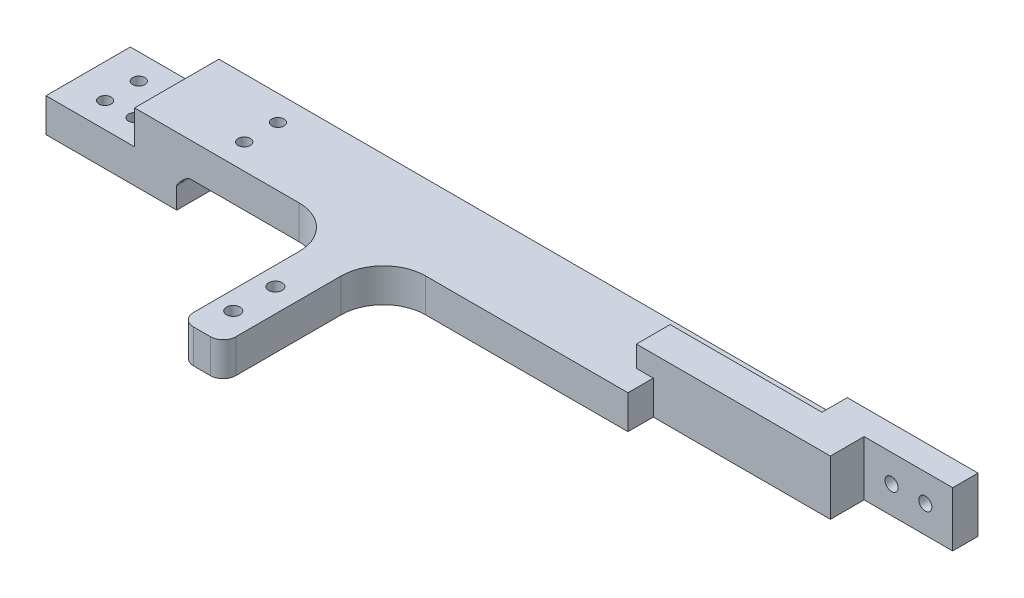
ISO-10303-21;
HEADER;
FILE_DESCRIPTION(('STEP AP214'),'2;1');
FILE_NAME('part.step','',(''),(''),'','','');
FILE_SCHEMA(('AUTOMOTIVE_DESIGN { 1 0 10303 214 1 1 1 1 }'));
ENDSEC;
DATA;
#1=APPLICATION_CONTEXT('core data for automotive mechanical design processes');
#2=APPLICATION_PROTOCOL_DEFINITION('international standard','automotive_design',2000,#1);
#3=PRODUCT_CONTEXT('',#1,'mechanical');
#4=PRODUCT('Part','Part','',(#3));
#5=PRODUCT_RELATED_PRODUCT_CATEGORY('part','',(#4));
#6=PRODUCT_DEFINITION_FORMATION('','',#4);
#7=PRODUCT_DEFINITION_CONTEXT('part definition',#1,'design');
#8=PRODUCT_DEFINITION('design','',#6,#7);
#9=PRODUCT_DEFINITION_SHAPE('','',#8);
#10=(LENGTH_UNIT() NAMED_UNIT(*) SI_UNIT(.MILLI.,.METRE.));
#11=(NAMED_UNIT(*) PLANE_ANGLE_UNIT() SI_UNIT($,.RADIAN.));
#12=(NAMED_UNIT(*) SI_UNIT($,.STERADIAN.) SOLID_ANGLE_UNIT());
#13=UNCERTAINTY_MEASURE_WITH_UNIT(LENGTH_MEASURE(1.E-05),#10,'distance_accuracy_value','');
#14=(GEOMETRIC_REPRESENTATION_CONTEXT(3) GLOBAL_UNCERTAINTY_ASSIGNED_CONTEXT((#13)) GLOBAL_UNIT_ASSIGNED_CONTEXT((#10,
#11,#12)) REPRESENTATION_CONTEXT('',''));
#15=CARTESIAN_POINT('',(0.,0.,0.));
#16=DIRECTION('',(0.,0.,1.));
#17=DIRECTION('',(1.,0.,0.));
#18=AXIS2_PLACEMENT_3D('',#15,#16,#17);
#19=CARTESIAN_POINT('',(0.,8.,20.));
#20=DIRECTION('',(0.,0.,-1.));
#21=DIRECTION('',(-1.,0.,0.));
#22=AXIS2_PLACEMENT_3D('',#19,#20,#21);
#23=PLANE('',#22);
#24=DIRECTION('',(0.,1.,0.));
#25=VECTOR('',#24,1.);
#26=CARTESIAN_POINT('',(68.,-8.,20.));
#27=LINE('',#26,#25);
#28=CARTESIAN_POINT('',(68.,-8.,20.));
#29=VERTEX_POINT('',#28);
#30=CARTESIAN_POINT('',(68.,-3.,20.));
#31=VERTEX_POINT('',#30);
#32=EDGE_CURVE('E491',#29,#31,#27,.T.);
#33=ORIENTED_EDGE('',*,*,#32,.T.);
#34=CARTESIAN_POINT('',(71.,0.,20.));
#35=CARTESIAN_POINT('',(68.,0.,20.));
#36=CARTESIAN_POINT('',(68.,-3.,20.));
#37=(BOUNDED_CURVE() B_SPLINE_CURVE(2,(#34,#35,#36),.UNSPECIFIED.,.F.,
.F.) B_SPLINE_CURVE_WITH_KNOTS((3,3),(0.,1.),
.UNSPECIFIED.) CURVE() GEOMETRIC_REPRESENTATION_ITEM() RATIONAL_B_SPLINE_CURVE((1.,
0.176470588235294,1.)) REPRESENTATION_ITEM(''));
#38=CARTESIAN_POINT('',(71.,0.,20.));
#39=VERTEX_POINT('',#38);
#40=EDGE_CURVE('E348',#31,#39,#37,.F.);
#41=ORIENTED_EDGE('',*,*,#40,.T.);
#42=DIRECTION('',(1.,0.,0.));
#43=VECTOR('',#42,1.);
#44=CARTESIAN_POINT('',(0.,0.,20.));
#45=LINE('',#44,#43);
#46=CARTESIAN_POINT('',(97.,0.,20.));
#47=VERTEX_POINT('',#46);
#48=EDGE_CURVE('E294',#39,#47,#45,.T.);
#49=ORIENTED_EDGE('',*,*,#48,.T.);
#50=DIRECTION('',(0.,-1.,0.));
#51=VECTOR('',#50,1.);
#52=CARTESIAN_POINT('',(97.,8.,20.));
#53=LINE('',#52,#51);
#54=CARTESIAN_POINT('',(97.,8.,20.));
#55=VERTEX_POINT('',#54);
#56=EDGE_CURVE('E600',#47,#55,#53,.F.);
#57=ORIENTED_EDGE('',*,*,#56,.T.);
#58=DIRECTION('',(1.,0.,0.));
#59=VECTOR('',#58,1.);
#60=CARTESIAN_POINT('',(0.,8.,20.));
#61=LINE('',#60,#59);
#62=CARTESIAN_POINT('',(58.,8.,20.));
#63=VERTEX_POINT('',#62);
#64=EDGE_CURVE('E284',#63,#55,#61,.T.);
#65=ORIENTED_EDGE('',*,*,#64,.F.);
#66=DIRECTION('',(0.,1.,0.));
#67=VECTOR('',#66,1.);
#68=CARTESIAN_POINT('',(58.,0.,20.));
#69=LINE('',#68,#67);
#70=CARTESIAN_POINT('',(58.,0.,20.));
#71=VERTEX_POINT('',#70);
#72=EDGE_CURVE('E225',#71,#63,#69,.T.);
#73=ORIENTED_EDGE('',*,*,#72,.F.);
#74=DIRECTION('',(1.,0.,0.));
#75=VECTOR('',#74,1.);
#76=CARTESIAN_POINT('',(37.,0.,20.));
#77=LINE('',#76,#75);
#78=CARTESIAN_POINT('',(37.,0.,20.));
#79=VERTEX_POINT('',#78);
#80=EDGE_CURVE('E210',#79,#71,#77,.T.);
#81=ORIENTED_EDGE('',*,*,#80,.F.);
#82=DIRECTION('',(0.,-1.,0.));
#83=VECTOR('',#82,1.);
#84=CARTESIAN_POINT('',(37.,8.,20.));
#85=LINE('',#84,#83);
#86=CARTESIAN_POINT('',(37.,-8.,20.));
#87=VERTEX_POINT('',#86);
#88=EDGE_CURVE('E222',#79,#87,#85,.T.);
#89=ORIENTED_EDGE('',*,*,#88,.T.);
#90=DIRECTION('',(-1.,0.,0.));
#91=VECTOR('',#90,1.);
#92=CARTESIAN_POINT('',(37.,-8.,20.));
#93=LINE('',#92,#91);
#94=EDGE_CURVE('E489',#29,#87,#93,.T.);
#95=ORIENTED_EDGE('',*,*,#94,.F.);
#96=EDGE_LOOP('',(#33,#41,#49,#57,#65,#73,#81,#89,#95));
#97=FACE_BOUND('',#96,.T.);
#98=ADVANCED_FACE('F39',(#97),#23,.F.);
#99=CARTESIAN_POINT('',(127.,8.,20.));
#100=VERTEX_POINT('',#99);
#101=CARTESIAN_POINT('',(175.,8.,20.));
#102=VERTEX_POINT('',#101);
#103=EDGE_CURVE('E288',#100,#102,#61,.T.);
#104=ORIENTED_EDGE('',*,*,#103,.F.);
#105=DIRECTION('',(0.,1.,0.));
#106=VECTOR('',#105,1.);
#107=CARTESIAN_POINT('',(127.,0.,20.));
#108=LINE('',#107,#106);
#109=CARTESIAN_POINT('',(127.,0.,20.));
#110=VERTEX_POINT('',#109);
#111=EDGE_CURVE('E588',#100,#110,#108,.F.);
#112=ORIENTED_EDGE('',*,*,#111,.T.);
#113=CARTESIAN_POINT('',(175.,0.,20.));
#114=VERTEX_POINT('',#113);
#115=EDGE_CURVE('E283',#110,#114,#45,.T.);
#116=ORIENTED_EDGE('',*,*,#115,.T.);
#117=DIRECTION('',(0.,1.,0.));
#118=VECTOR('',#117,1.);
#119=CARTESIAN_POINT('',(175.,-5.00000000000186,20.));
#120=LINE('',#119,#118);
#121=EDGE_CURVE('E253',#114,#102,#120,.T.);
#122=ORIENTED_EDGE('',*,*,#121,.T.);
#123=EDGE_LOOP('',(#104,#112,#116,#122));
#124=FACE_BOUND('',#123,.T.);
#125=ADVANCED_FACE('F550',(#124),#23,.F.);
#126=CARTESIAN_POINT('',(37.,0.,0.));
#127=DIRECTION('',(1.,0.,0.));
#128=DIRECTION('',(0.,0.,-1.));
#129=AXIS2_PLACEMENT_3D('',#126,#127,#128);
#130=PLANE('',#129);
#131=DIRECTION('',(0.,0.,1.));
#132=VECTOR('',#131,1.);
#133=CARTESIAN_POINT('',(37.,0.,0.));
#134=LINE('',#133,#132);
#135=CARTESIAN_POINT('',(37.,0.,0.));
#136=VERTEX_POINT('',#135);
#137=EDGE_CURVE('E206',#136,#79,#134,.T.);
#138=ORIENTED_EDGE('',*,*,#137,.F.);
#139=DIRECTION('',(0.,1.,0.));
#140=VECTOR('',#139,1.);
#141=CARTESIAN_POINT('',(37.,8.,0.));
#142=LINE('',#141,#140);
#143=CARTESIAN_POINT('',(37.,-8.,0.));
#144=VERTEX_POINT('',#143);
#145=EDGE_CURVE('E232',#144,#136,#142,.T.);
#146=ORIENTED_EDGE('',*,*,#145,.F.);
#147=DIRECTION('',(0.,0.,-1.));
#148=VECTOR('',#147,1.);
#149=CARTESIAN_POINT('',(37.,-8.,20.));
#150=LINE('',#149,#148);
#151=EDGE_CURVE('E231',#87,#144,#150,.T.);
#152=ORIENTED_EDGE('',*,*,#151,.F.);
#153=ORIENTED_EDGE('',*,*,#88,.F.);
#154=EDGE_LOOP('',(#138,#146,#152,#153));
#155=FACE_BOUND('',#154,.T.);
#156=ADVANCED_FACE('F229',(#155),#130,.F.);
#157=CARTESIAN_POINT('',(0.,0.,0.));
#158=DIRECTION('',(0.,1.,0.));
#159=DIRECTION('',(0.,0.,1.));
#160=AXIS2_PLACEMENT_3D('',#157,#158,#159);
#161=PLANE('',#160);
#162=CARTESIAN_POINT('',(111.4,0.,40.));
#163=DIRECTION('',(0.,1.,0.));
#164=DIRECTION('',(0.,0.,1.));
#165=AXIS2_PLACEMENT_3D('',#162,#163,#164);
#166=CIRCLE('',#165,1.60000000000001);
#167=CARTESIAN_POINT('',(111.4,0.,41.6));
#168=VERTEX_POINT('',#167);
#169=EDGE_CURVE('E1090',#168,#168,#166,.T.);
#170=ORIENTED_EDGE('',*,*,#169,.T.);
#171=EDGE_LOOP('',(#170));
#172=FACE_BOUND('',#171,.T.);
#173=CARTESIAN_POINT('',(111.4,0.,50.));
#174=DIRECTION('',(0.,1.,0.));
#175=DIRECTION('',(0.,0.,1.));
#176=AXIS2_PLACEMENT_3D('',#173,#174,#175);
#177=CIRCLE('',#176,1.60000000000001);
#178=CARTESIAN_POINT('',(111.4,0.,51.6));
#179=VERTEX_POINT('',#178);
#180=EDGE_CURVE('E435',#179,#179,#177,.T.);
#181=ORIENTED_EDGE('',*,*,#180,.T.);
#182=EDGE_LOOP('',(#181));
#183=FACE_BOUND('',#182,.T.);
#184=CARTESIAN_POINT('',(78.,0.,6.));
#185=DIRECTION('',(0.,1.,0.));
#186=DIRECTION('',(0.,0.,1.));
#187=AXIS2_PLACEMENT_3D('',#184,#185,#186);
#188=CIRCLE('',#187,1.45);
#189=CARTESIAN_POINT('',(78.,0.,7.45));
#190=VERTEX_POINT('',#189);
#191=EDGE_CURVE('E248',#190,#190,#188,.T.);
#192=ORIENTED_EDGE('',*,*,#191,.T.);
#193=EDGE_LOOP('',(#192));
#194=FACE_BOUND('',#193,.T.);
#195=CARTESIAN_POINT('',(78.,0.,14.));
#196=DIRECTION('',(0.,1.,0.));
#197=DIRECTION('',(0.,0.,1.));
#198=AXIS2_PLACEMENT_3D('',#195,#196,#197);
#199=CIRCLE('',#198,1.45);
#200=CARTESIAN_POINT('',(78.,0.,15.45));
#201=VERTEX_POINT('',#200);
#202=EDGE_CURVE('E244',#201,#201,#199,.T.);
#203=ORIENTED_EDGE('',*,*,#202,.T.);
#204=EDGE_LOOP('',(#203));
#205=FACE_BOUND('',#204,.T.);
#206=DIRECTION('',(0.,0.,-1.));
#207=VECTOR('',#206,1.);
#208=CARTESIAN_POINT('',(117.,0.,58.));
#209=LINE('',#208,#207);
#210=CARTESIAN_POINT('',(117.,0.,55.));
#211=VERTEX_POINT('',#210);
#212=CARTESIAN_POINT('',(117.,0.,30.));
#213=VERTEX_POINT('',#212);
#214=EDGE_CURVE('E426',#211,#213,#209,.T.);
#215=ORIENTED_EDGE('',*,*,#214,.F.);
#216=CARTESIAN_POINT('',(114.,0.,55.));
#217=DIRECTION('',(0.,1.,0.));
#218=DIRECTION('',(0.,0.,1.));
#219=AXIS2_PLACEMENT_3D('',#216,#217,#218);
#220=CIRCLE('',#219,3.);
#221=CARTESIAN_POINT('',(114.,0.,58.));
#222=VERTEX_POINT('',#221);
#223=EDGE_CURVE('E47',#211,#222,#220,.F.);
#224=ORIENTED_EDGE('',*,*,#223,.T.);
#225=DIRECTION('',(1.,0.,0.));
#226=VECTOR('',#225,1.);
#227=CARTESIAN_POINT('',(107.,0.,58.));
#228=LINE('',#227,#226);
#229=CARTESIAN_POINT('',(110.,0.,58.));
#230=VERTEX_POINT('',#229);
#231=EDGE_CURVE('E424',#230,#222,#228,.T.);
#232=ORIENTED_EDGE('',*,*,#231,.F.);
#233=CARTESIAN_POINT('',(110.,0.,55.));
#234=DIRECTION('',(0.,1.,0.));
#235=DIRECTION('',(0.,0.,1.));
#236=AXIS2_PLACEMENT_3D('',#233,#234,#235);
#237=CIRCLE('',#236,3.);
#238=CARTESIAN_POINT('',(107.,0.,55.));
#239=VERTEX_POINT('',#238);
#240=EDGE_CURVE('E54',#230,#239,#237,.F.);
#241=ORIENTED_EDGE('',*,*,#240,.T.);
#242=DIRECTION('',(0.,0.,-1.));
#243=VECTOR('',#242,1.);
#244=CARTESIAN_POINT('',(107.,0.,58.));
#245=LINE('',#244,#243);
#246=CARTESIAN_POINT('',(107.,0.,30.));
#247=VERTEX_POINT('',#246);
#248=EDGE_CURVE('E447',#239,#247,#245,.T.);
#249=ORIENTED_EDGE('',*,*,#248,.T.);
#250=CARTESIAN_POINT('',(97.,0.,30.));
#251=DIRECTION('',(0.,1.,0.));
#252=DIRECTION('',(0.,0.,1.));
#253=AXIS2_PLACEMENT_3D('',#250,#251,#252);
#254=CIRCLE('',#253,10.);
#255=EDGE_CURVE('E595',#247,#47,#254,.T.);
#256=ORIENTED_EDGE('',*,*,#255,.T.);
#257=ORIENTED_EDGE('',*,*,#48,.F.);
#258=CARTESIAN_POINT('',(71.,0.,-1.));
#259=CARTESIAN_POINT('',(71.,0.,6.33333333333335));
#260=CARTESIAN_POINT('',(71.,0.,13.6666666666666));
#261=CARTESIAN_POINT('',(71.,0.,21.));
#262=(BOUNDED_CURVE() B_SPLINE_CURVE(3,(#258,#259,#260,#261),.UNSPECIFIED.,.F.,
.F.) B_SPLINE_CURVE_WITH_KNOTS((4,4),(-0.001,0.021),
.UNSPECIFIED.) CURVE() GEOMETRIC_REPRESENTATION_ITEM() RATIONAL_B_SPLINE_CURVE((1.,1.,1.,1.)) REPRESENTATION_ITEM(''));
#263=CARTESIAN_POINT('',(71.,0.,0.));
#264=VERTEX_POINT('',#263);
#265=EDGE_CURVE('E306',#39,#264,#262,.F.);
#266=ORIENTED_EDGE('',*,*,#265,.T.);
#267=DIRECTION('',(-1.,0.,0.));
#268=VECTOR('',#267,1.);
#269=CARTESIAN_POINT('',(0.,0.,0.));
#270=LINE('',#269,#268);
#271=CARTESIAN_POINT('',(238.,0.,0.));
#272=VERTEX_POINT('',#271);
#273=EDGE_CURVE('E300',#272,#264,#270,.T.);
#274=ORIENTED_EDGE('',*,*,#273,.F.);
#275=DIRECTION('',(0.,0.,1.));
#276=VECTOR('',#275,1.);
#277=CARTESIAN_POINT('',(238.,0.,0.));
#278=LINE('',#277,#276);
#279=CARTESIAN_POINT('',(238.,0.,6.00000000000001));
#280=VERTEX_POINT('',#279);
#281=EDGE_CURVE('E238',#272,#280,#278,.T.);
#282=ORIENTED_EDGE('',*,*,#281,.T.);
#283=DIRECTION('',(1.,0.,0.));
#284=VECTOR('',#283,1.);
#285=CARTESIAN_POINT('',(217.,0.,6.00000000000001));
#286=LINE('',#285,#284);
#287=CARTESIAN_POINT('',(217.,0.,6.00000000000001));
#288=VERTEX_POINT('',#287);
#289=EDGE_CURVE('E648',#288,#280,#286,.T.);
#290=ORIENTED_EDGE('',*,*,#289,.F.);
#291=DIRECTION('',(0.,0.,-1.));
#292=VECTOR('',#291,1.);
#293=CARTESIAN_POINT('',(217.,0.,6.00000000000001));
#294=LINE('',#293,#292);
#295=CARTESIAN_POINT('',(217.,0.,14.));
#296=VERTEX_POINT('',#295);
#297=EDGE_CURVE('E645',#296,#288,#294,.T.);
#298=ORIENTED_EDGE('',*,*,#297,.F.);
#299=DIRECTION('',(1.,0.,0.));
#300=VECTOR('',#299,1.);
#301=CARTESIAN_POINT('',(241.,0.,14.));
#302=LINE('',#301,#300);
#303=CARTESIAN_POINT('',(175.,0.,14.));
#304=VERTEX_POINT('',#303);
#305=EDGE_CURVE('E278',#304,#296,#302,.T.);
#306=ORIENTED_EDGE('',*,*,#305,.F.);
#307=DIRECTION('',(0.,0.,1.));
#308=VECTOR('',#307,1.);
#309=CARTESIAN_POINT('',(175.,0.,0.));
#310=LINE('',#309,#308);
#311=EDGE_CURVE('E256',#304,#114,#310,.T.);
#312=ORIENTED_EDGE('',*,*,#311,.T.);
#313=ORIENTED_EDGE('',*,*,#115,.F.);
#314=CARTESIAN_POINT('',(127.,0.,30.));
#315=DIRECTION('',(0.,1.,0.));
#316=DIRECTION('',(0.,0.,1.));
#317=AXIS2_PLACEMENT_3D('',#314,#315,#316);
#318=CIRCLE('',#317,10.);
#319=EDGE_CURVE('E500',#110,#213,#318,.T.);
#320=ORIENTED_EDGE('',*,*,#319,.T.);
#321=EDGE_LOOP('',(#215,#224,#232,#241,#249,#256,#257,#266,#274,#282,#290,#298,#306,#312,#313,#320));
#322=FACE_BOUND('',#321,.T.);
#323=ADVANCED_FACE('F313',(#172,#183,#194,#205,#322),#161,.F.);
#324=CARTESIAN_POINT('',(0.,8.,0.));
#325=DIRECTION('',(0.,1.,0.));
#326=DIRECTION('',(0.,0.,1.));
#327=AXIS2_PLACEMENT_3D('',#324,#325,#326);
#328=PLANE('',#327);
#329=CARTESIAN_POINT('',(111.4,8.,40.));
#330=DIRECTION('',(0.,1.,0.));
#331=DIRECTION('',(0.,0.,1.));
#332=AXIS2_PLACEMENT_3D('',#329,#330,#331);
#333=CIRCLE('',#332,1.60000000000001);
#334=CARTESIAN_POINT('',(111.4,8.,41.6));
#335=VERTEX_POINT('',#334);
#336=EDGE_CURVE('E1095',#335,#335,#333,.T.);
#337=ORIENTED_EDGE('',*,*,#336,.F.);
#338=EDGE_LOOP('',(#337));
#339=FACE_BOUND('',#338,.T.);
#340=CARTESIAN_POINT('',(111.4,8.,50.));
#341=DIRECTION('',(0.,1.,0.));
#342=DIRECTION('',(0.,0.,1.));
#343=AXIS2_PLACEMENT_3D('',#340,#341,#342);
#344=CIRCLE('',#343,1.60000000000001);
#345=CARTESIAN_POINT('',(111.4,8.,51.6));
#346=VERTEX_POINT('',#345);
#347=EDGE_CURVE('E1085',#346,#346,#344,.T.);
#348=ORIENTED_EDGE('',*,*,#347,.F.);
#349=EDGE_LOOP('',(#348));
#350=FACE_BOUND('',#349,.T.);
#351=DIRECTION('',(-1.,0.,0.));
#352=VECTOR('',#351,1.);
#353=CARTESIAN_POINT('',(107.,8.,58.));
#354=LINE('',#353,#352);
#355=CARTESIAN_POINT('',(114.,8.,58.));
#356=VERTEX_POINT('',#355);
#357=CARTESIAN_POINT('',(110.,8.,58.));
#358=VERTEX_POINT('',#357);
#359=EDGE_CURVE('E434',#356,#358,#354,.T.);
#360=ORIENTED_EDGE('',*,*,#359,.F.);
#361=CARTESIAN_POINT('',(114.,8.,55.));
#362=DIRECTION('',(0.,1.,0.));
#363=DIRECTION('',(0.,0.,1.));
#364=AXIS2_PLACEMENT_3D('',#361,#362,#363);
#365=CIRCLE('',#364,3.);
#366=CARTESIAN_POINT('',(117.,8.,55.));
#367=VERTEX_POINT('',#366);
#368=EDGE_CURVE('E419',#356,#367,#365,.T.);
#369=ORIENTED_EDGE('',*,*,#368,.T.);
#370=DIRECTION('',(0.,0.,-1.));
#371=VECTOR('',#370,1.);
#372=CARTESIAN_POINT('',(117.,8.,58.));
#373=LINE('',#372,#371);
#374=CARTESIAN_POINT('',(117.,8.,30.));
#375=VERTEX_POINT('',#374);
#376=EDGE_CURVE('E439',#367,#375,#373,.T.);
#377=ORIENTED_EDGE('',*,*,#376,.T.);
#378=CARTESIAN_POINT('',(127.,8.,30.));
#379=DIRECTION('',(0.,1.,0.));
#380=DIRECTION('',(0.,0.,1.));
#381=AXIS2_PLACEMENT_3D('',#378,#379,#380);
#382=CIRCLE('',#381,10.);
#383=EDGE_CURVE('E594',#375,#100,#382,.F.);
#384=ORIENTED_EDGE('',*,*,#383,.T.);
#385=ORIENTED_EDGE('',*,*,#103,.T.);
#386=DIRECTION('',(0.,0.,1.));
#387=VECTOR('',#386,1.);
#388=CARTESIAN_POINT('',(175.,8.,14.));
#389=LINE('',#388,#387);
#390=CARTESIAN_POINT('',(175.,8.,14.));
#391=VERTEX_POINT('',#390);
#392=EDGE_CURVE('E249',#391,#102,#389,.T.);
#393=ORIENTED_EDGE('',*,*,#392,.F.);
#394=DIRECTION('',(1.,0.,0.));
#395=VECTOR('',#394,1.);
#396=CARTESIAN_POINT('',(241.,8.,14.));
#397=LINE('',#396,#395);
#398=CARTESIAN_POINT('',(171.,8.,14.));
#399=VERTEX_POINT('',#398);
#400=EDGE_CURVE('E264',#399,#391,#397,.T.);
#401=ORIENTED_EDGE('',*,*,#400,.F.);
#402=DIRECTION('',(0.,0.,1.));
#403=VECTOR('',#402,1.);
#404=CARTESIAN_POINT('',(171.,8.,14.));
#405=LINE('',#404,#403);
#406=CARTESIAN_POINT('',(171.,8.,6.00000000000001));
#407=VERTEX_POINT('',#406);
#408=EDGE_CURVE('E260',#407,#399,#405,.T.);
#409=ORIENTED_EDGE('',*,*,#408,.F.);
#410=DIRECTION('',(-1.,0.,0.));
#411=VECTOR('',#410,1.);
#412=CARTESIAN_POINT('',(241.,8.,6.00000000000001));
#413=LINE('',#412,#411);
#414=CARTESIAN_POINT('',(207.,8.,6.00000000000001));
#415=VERTEX_POINT('',#414);
#416=EDGE_CURVE('E281',#415,#407,#413,.T.);
#417=ORIENTED_EDGE('',*,*,#416,.F.);
#418=DIRECTION('',(0.,0.,1.));
#419=VECTOR('',#418,1.);
#420=CARTESIAN_POINT('',(207.,8.,6.00000000000001));
#421=LINE('',#420,#419);
#422=CARTESIAN_POINT('',(207.,8.,0.));
#423=VERTEX_POINT('',#422);
#424=EDGE_CURVE('E617',#423,#415,#421,.T.);
#425=ORIENTED_EDGE('',*,*,#424,.F.);
#426=DIRECTION('',(-1.,0.,0.));
#427=VECTOR('',#426,1.);
#428=CARTESIAN_POINT('',(0.,8.,0.));
#429=LINE('',#428,#427);
#430=CARTESIAN_POINT('',(58.,8.,0.));
#431=VERTEX_POINT('',#430);
#432=EDGE_CURVE('E287',#423,#431,#429,.T.);
#433=ORIENTED_EDGE('',*,*,#432,.T.);
#434=DIRECTION('',(0.,0.,-1.));
#435=VECTOR('',#434,1.);
#436=CARTESIAN_POINT('',(58.,8.,0.));
#437=LINE('',#436,#435);
#438=EDGE_CURVE('E217',#63,#431,#437,.T.);
#439=ORIENTED_EDGE('',*,*,#438,.F.);
#440=ORIENTED_EDGE('',*,*,#64,.T.);
#441=CARTESIAN_POINT('',(97.,8.,30.));
#442=DIRECTION('',(0.,1.,0.));
#443=DIRECTION('',(0.,0.,1.));
#444=AXIS2_PLACEMENT_3D('',#441,#442,#443);
#445=CIRCLE('',#444,10.);
#446=CARTESIAN_POINT('',(107.,8.,30.));
#447=VERTEX_POINT('',#446);
#448=EDGE_CURVE('E598',#55,#447,#445,.F.);
#449=ORIENTED_EDGE('',*,*,#448,.T.);
#450=DIRECTION('',(0.,0.,-1.));
#451=VECTOR('',#450,1.);
#452=CARTESIAN_POINT('',(107.,8.,58.));
#453=LINE('',#452,#451);
#454=CARTESIAN_POINT('',(107.,8.,55.));
#455=VERTEX_POINT('',#454);
#456=EDGE_CURVE('E445',#455,#447,#453,.T.);
#457=ORIENTED_EDGE('',*,*,#456,.F.);
#458=CARTESIAN_POINT('',(110.,8.,55.));
#459=DIRECTION('',(0.,1.,0.));
#460=DIRECTION('',(0.,0.,1.));
#461=AXIS2_PLACEMENT_3D('',#458,#459,#460);
#462=CIRCLE('',#461,3.);
#463=EDGE_CURVE('E417',#455,#358,#462,.T.);
#464=ORIENTED_EDGE('',*,*,#463,.T.);
#465=EDGE_LOOP('',(#360,#369,#377,#384,#385,#393,#401,#409,#417,#425,#433,#439,#440,#449,#457,#464));
#466=FACE_BOUND('',#465,.T.);
#467=CARTESIAN_POINT('',(78.,8.,14.));
#468=DIRECTION('',(0.,1.,0.));
#469=DIRECTION('',(0.,0.,1.));
#470=AXIS2_PLACEMENT_3D('',#467,#468,#469);
#471=CIRCLE('',#470,1.45);
#472=CARTESIAN_POINT('',(78.,8.,15.45));
#473=VERTEX_POINT('',#472);
#474=EDGE_CURVE('E235',#473,#473,#471,.T.);
#475=ORIENTED_EDGE('',*,*,#474,.F.);
#476=EDGE_LOOP('',(#475));
#477=FACE_BOUND('',#476,.T.);
#478=CARTESIAN_POINT('',(78.,8.,6.));
#479=DIRECTION('',(0.,1.,0.));
#480=DIRECTION('',(0.,0.,1.));
#481=AXIS2_PLACEMENT_3D('',#478,#479,#480);
#482=CIRCLE('',#481,1.45);
#483=CARTESIAN_POINT('',(78.,8.,7.45));
#484=VERTEX_POINT('',#483);
#485=EDGE_CURVE('E245',#484,#484,#482,.T.);
#486=ORIENTED_EDGE('',*,*,#485,.F.);
#487=EDGE_LOOP('',(#486));
#488=FACE_BOUND('',#487,.T.);
#489=ADVANCED_FACE('F323',(#339,#350,#466,#477,#488),#328,.T.);
#490=CARTESIAN_POINT('',(241.,22.,6.00000000000001));
#491=DIRECTION('',(0.,0.,1.));
#492=DIRECTION('',(1.,0.,0.));
#493=AXIS2_PLACEMENT_3D('',#490,#491,#492);
#494=PLANE('',#493);
#495=DIRECTION('',(0.,-1.,0.));
#496=VECTOR('',#495,1.);
#497=CARTESIAN_POINT('',(207.,13.,6.00000000000001));
#498=LINE('',#497,#496);
#499=CARTESIAN_POINT('',(207.,13.,6.00000000000001));
#500=VERTEX_POINT('',#499);
#501=EDGE_CURVE('E633',#500,#415,#498,.T.);
#502=ORIENTED_EDGE('',*,*,#501,.T.);
#503=ORIENTED_EDGE('',*,*,#416,.T.);
#504=DIRECTION('',(0.,-1.,0.));
#505=VECTOR('',#504,1.);
#506=CARTESIAN_POINT('',(171.,13.,6.00000000000001));
#507=LINE('',#506,#505);
#508=CARTESIAN_POINT('',(171.,13.,6.00000000000001));
#509=VERTEX_POINT('',#508);
#510=EDGE_CURVE('E275',#509,#407,#507,.T.);
#511=ORIENTED_EDGE('',*,*,#510,.F.);
#512=DIRECTION('',(-1.,0.,0.));
#513=VECTOR('',#512,1.);
#514=CARTESIAN_POINT('',(241.,13.,6.00000000000001));
#515=LINE('',#514,#513);
#516=EDGE_CURVE('E261',#500,#509,#515,.T.);
#517=ORIENTED_EDGE('',*,*,#516,.F.);
#518=EDGE_LOOP('',(#502,#503,#511,#517));
#519=FACE_BOUND('',#518,.T.);
#520=ADVANCED_FACE('F331',(#519),#494,.F.);
#521=CARTESIAN_POINT('',(0.,8.,0.));
#522=DIRECTION('',(0.,0.,1.));
#523=DIRECTION('',(1.,0.,0.));
#524=AXIS2_PLACEMENT_3D('',#521,#522,#523);
#525=PLANE('',#524);
#526=CARTESIAN_POINT('',(223.5,6.5,0.));
#527=DIRECTION('',(0.,0.,1.));
#528=DIRECTION('',(1.,0.,0.));
#529=AXIS2_PLACEMENT_3D('',#526,#527,#528);
#530=CIRCLE('',#529,1.54999999999999);
#531=CARTESIAN_POINT('',(225.05,6.5,0.));
#532=VERTEX_POINT('',#531);
#533=EDGE_CURVE('E664',#532,#532,#530,.T.);
#534=ORIENTED_EDGE('',*,*,#533,.T.);
#535=EDGE_LOOP('',(#534));
#536=FACE_BOUND('',#535,.T.);
#537=CARTESIAN_POINT('',(231.5,6.5,0.));
#538=DIRECTION('',(0.,0.,1.));
#539=DIRECTION('',(1.,0.,0.));
#540=AXIS2_PLACEMENT_3D('',#537,#538,#539);
#541=CIRCLE('',#540,1.54999999999999);
#542=CARTESIAN_POINT('',(233.05,6.5,0.));
#543=VERTEX_POINT('',#542);
#544=EDGE_CURVE('E621',#543,#543,#541,.T.);
#545=ORIENTED_EDGE('',*,*,#544,.T.);
#546=EDGE_LOOP('',(#545));
#547=FACE_BOUND('',#546,.T.);
#548=DIRECTION('',(-1.,0.,0.));
#549=VECTOR('',#548,1.);
#550=CARTESIAN_POINT('',(37.,0.,0.));
#551=LINE('',#550,#549);
#552=CARTESIAN_POINT('',(58.,0.,0.));
#553=VERTEX_POINT('',#552);
#554=EDGE_CURVE('E213',#553,#136,#551,.T.);
#555=ORIENTED_EDGE('',*,*,#554,.F.);
#556=DIRECTION('',(0.,1.,0.));
#557=VECTOR('',#556,1.);
#558=CARTESIAN_POINT('',(58.,0.,0.));
#559=LINE('',#558,#557);
#560=EDGE_CURVE('E480',#553,#431,#559,.T.);
#561=ORIENTED_EDGE('',*,*,#560,.T.);
#562=ORIENTED_EDGE('',*,*,#432,.F.);
#563=DIRECTION('',(0.,-1.,0.));
#564=VECTOR('',#563,1.);
#565=CARTESIAN_POINT('',(207.,13.,0.));
#566=LINE('',#565,#564);
#567=CARTESIAN_POINT('',(207.,13.,0.));
#568=VERTEX_POINT('',#567);
#569=EDGE_CURVE('E635',#568,#423,#566,.T.);
#570=ORIENTED_EDGE('',*,*,#569,.F.);
#571=DIRECTION('',(-1.,0.,0.));
#572=VECTOR('',#571,1.);
#573=CARTESIAN_POINT('',(238.,13.,0.));
#574=LINE('',#573,#572);
#575=CARTESIAN_POINT('',(238.,13.,0.));
#576=VERTEX_POINT('',#575);
#577=EDGE_CURVE('E624',#576,#568,#574,.T.);
#578=ORIENTED_EDGE('',*,*,#577,.F.);
#579=DIRECTION('',(0.,-1.,0.));
#580=VECTOR('',#579,1.);
#581=CARTESIAN_POINT('',(238.,8.,0.));
#582=LINE('',#581,#580);
#583=EDGE_CURVE('E233',#576,#272,#582,.T.);
#584=ORIENTED_EDGE('',*,*,#583,.T.);
#585=ORIENTED_EDGE('',*,*,#273,.T.);
#586=CARTESIAN_POINT('',(68.,-3.,0.));
#587=CARTESIAN_POINT('',(68.,0.,0.));
#588=CARTESIAN_POINT('',(71.,0.,0.));
#589=(BOUNDED_CURVE() B_SPLINE_CURVE(2,(#586,#587,#588),.UNSPECIFIED.,.F.,
.F.) B_SPLINE_CURVE_WITH_KNOTS((3,3),(0.,1.),
.UNSPECIFIED.) CURVE() GEOMETRIC_REPRESENTATION_ITEM() RATIONAL_B_SPLINE_CURVE((1.,
0.176470588235294,1.)) REPRESENTATION_ITEM(''));
#590=CARTESIAN_POINT('',(68.,-3.,0.));
#591=VERTEX_POINT('',#590);
#592=EDGE_CURVE('E414',#264,#591,#589,.F.);
#593=ORIENTED_EDGE('',*,*,#592,.T.);
#594=DIRECTION('',(0.,1.,0.));
#595=VECTOR('',#594,1.);
#596=CARTESIAN_POINT('',(68.,-8.,0.));
#597=LINE('',#596,#595);
#598=CARTESIAN_POINT('',(68.,-8.,0.));
#599=VERTEX_POINT('',#598);
#600=EDGE_CURVE('E499',#599,#591,#597,.T.);
#601=ORIENTED_EDGE('',*,*,#600,.F.);
#602=DIRECTION('',(1.,0.,0.));
#603=VECTOR('',#602,1.);
#604=CARTESIAN_POINT('',(37.,-8.,0.));
#605=LINE('',#604,#603);
#606=EDGE_CURVE('E485',#144,#599,#605,.T.);
#607=ORIENTED_EDGE('',*,*,#606,.F.);
#608=ORIENTED_EDGE('',*,*,#145,.T.);
#609=EDGE_LOOP('',(#555,#561,#562,#570,#578,#584,#585,#593,#601,#607,#608));
#610=FACE_BOUND('',#609,.T.);
#611=ADVANCED_FACE('F326',(#536,#547,#610),#525,.F.);
#612=CARTESIAN_POINT('',(241.,14.,14.));
#613=DIRECTION('',(0.,0.,-1.));
#614=DIRECTION('',(-1.,0.,0.));
#615=AXIS2_PLACEMENT_3D('',#612,#613,#614);
#616=PLANE('',#615);
#617=ORIENTED_EDGE('',*,*,#305,.T.);
#618=DIRECTION('',(0.,-1.,0.));
#619=VECTOR('',#618,1.);
#620=CARTESIAN_POINT('',(217.,13.,14.));
#621=LINE('',#620,#619);
#622=CARTESIAN_POINT('',(217.,13.,14.));
#623=VERTEX_POINT('',#622);
#624=EDGE_CURVE('E643',#623,#296,#621,.T.);
#625=ORIENTED_EDGE('',*,*,#624,.F.);
#626=DIRECTION('',(1.,0.,0.));
#627=VECTOR('',#626,1.);
#628=CARTESIAN_POINT('',(241.,13.,14.));
#629=LINE('',#628,#627);
#630=CARTESIAN_POINT('',(171.,13.,14.));
#631=VERTEX_POINT('',#630);
#632=EDGE_CURVE('E266',#631,#623,#629,.T.);
#633=ORIENTED_EDGE('',*,*,#632,.F.);
#634=DIRECTION('',(0.,-1.,0.));
#635=VECTOR('',#634,1.);
#636=CARTESIAN_POINT('',(171.,13.,14.));
#637=LINE('',#636,#635);
#638=EDGE_CURVE('E269',#631,#399,#637,.T.);
#639=ORIENTED_EDGE('',*,*,#638,.T.);
#640=ORIENTED_EDGE('',*,*,#400,.T.);
#641=DIRECTION('',(0.,1.,0.));
#642=VECTOR('',#641,1.);
#643=CARTESIAN_POINT('',(175.,-5.00000000000186,14.));
#644=LINE('',#643,#642);
#645=EDGE_CURVE('E252',#304,#391,#644,.T.);
#646=ORIENTED_EDGE('',*,*,#645,.F.);
#647=EDGE_LOOP('',(#617,#625,#633,#639,#640,#646));
#648=FACE_BOUND('',#647,.T.);
#649=ADVANCED_FACE('F330',(#648),#616,.F.);
#650=CARTESIAN_POINT('',(171.,13.,14.));
#651=DIRECTION('',(1.,0.,0.));
#652=DIRECTION('',(0.,0.,-1.));
#653=AXIS2_PLACEMENT_3D('',#650,#651,#652);
#654=PLANE('',#653);
#655=ORIENTED_EDGE('',*,*,#408,.T.);
#656=ORIENTED_EDGE('',*,*,#638,.F.);
#657=DIRECTION('',(0.,0.,1.));
#658=VECTOR('',#657,1.);
#659=CARTESIAN_POINT('',(171.,13.,14.));
#660=LINE('',#659,#658);
#661=EDGE_CURVE('E263',#509,#631,#660,.T.);
#662=ORIENTED_EDGE('',*,*,#661,.F.);
#663=ORIENTED_EDGE('',*,*,#510,.T.);
#664=EDGE_LOOP('',(#655,#656,#662,#663));
#665=FACE_BOUND('',#664,.T.);
#666=ADVANCED_FACE('F565',(#665),#654,.F.);
#667=CARTESIAN_POINT('',(0.,13.,0.));
#668=DIRECTION('',(0.,-1.,0.));
#669=DIRECTION('',(0.,0.,-1.));
#670=AXIS2_PLACEMENT_3D('',#667,#668,#669);
#671=PLANE('',#670);
#672=ORIENTED_EDGE('',*,*,#632,.T.);
#673=DIRECTION('',(0.,0.,1.));
#674=VECTOR('',#673,1.);
#675=CARTESIAN_POINT('',(217.,13.,6.00000000000001));
#676=LINE('',#675,#674);
#677=CARTESIAN_POINT('',(217.,13.,6.00000000000001));
#678=VERTEX_POINT('',#677);
#679=EDGE_CURVE('E641',#678,#623,#676,.T.);
#680=ORIENTED_EDGE('',*,*,#679,.F.);
#681=DIRECTION('',(1.,0.,0.));
#682=VECTOR('',#681,1.);
#683=CARTESIAN_POINT('',(238.,13.,6.00000000000001));
#684=LINE('',#683,#682);
#685=CARTESIAN_POINT('',(238.,13.,6.00000000000001));
#686=VERTEX_POINT('',#685);
#687=EDGE_CURVE('E631',#678,#686,#684,.T.);
#688=ORIENTED_EDGE('',*,*,#687,.T.);
#689=DIRECTION('',(0.,0.,-1.));
#690=VECTOR('',#689,1.);
#691=CARTESIAN_POINT('',(238.,13.,6.00000000000001));
#692=LINE('',#691,#690);
#693=EDGE_CURVE('E620',#686,#576,#692,.T.);
#694=ORIENTED_EDGE('',*,*,#693,.T.);
#695=ORIENTED_EDGE('',*,*,#577,.T.);
#696=DIRECTION('',(0.,0.,1.));
#697=VECTOR('',#696,1.);
#698=CARTESIAN_POINT('',(207.,13.,6.00000000000001));
#699=LINE('',#698,#697);
#700=EDGE_CURVE('E657',#568,#500,#699,.T.);
#701=ORIENTED_EDGE('',*,*,#700,.T.);
#702=ORIENTED_EDGE('',*,*,#516,.T.);
#703=ORIENTED_EDGE('',*,*,#661,.T.);
#704=EDGE_LOOP('',(#672,#680,#688,#694,#695,#701,#702,#703));
#705=FACE_BOUND('',#704,.T.);
#706=ADVANCED_FACE('F561',(#705),#671,.F.);
#707=CARTESIAN_POINT('',(175.,-5.00000000000186,14.));
#708=DIRECTION('',(-1.,0.,0.));
#709=DIRECTION('',(0.,0.,1.));
#710=AXIS2_PLACEMENT_3D('',#707,#708,#709);
#711=PLANE('',#710);
#712=ORIENTED_EDGE('',*,*,#645,.T.);
#713=ORIENTED_EDGE('',*,*,#392,.T.);
#714=ORIENTED_EDGE('',*,*,#121,.F.);
#715=ORIENTED_EDGE('',*,*,#311,.F.);
#716=EDGE_LOOP('',(#712,#713,#714,#715));
#717=FACE_BOUND('',#716,.T.);
#718=ADVANCED_FACE('F557',(#717),#711,.F.);
#719=CARTESIAN_POINT('',(78.,-5.00000000000186,6.));
#720=DIRECTION('',(0.,1.,0.));
#721=DIRECTION('',(0.,0.,1.));
#722=AXIS2_PLACEMENT_3D('',#719,#720,#721);
#723=CYLINDRICAL_SURFACE('',#722,1.45);
#724=ORIENTED_EDGE('',*,*,#485,.T.);
#725=EDGE_LOOP('',(#724));
#726=FACE_BOUND('',#725,.T.);
#727=ORIENTED_EDGE('',*,*,#191,.F.);
#728=EDGE_LOOP('',(#727));
#729=FACE_BOUND('',#728,.T.);
#730=ADVANCED_FACE('F553',(#726,#729),#723,.F.);
#731=CARTESIAN_POINT('',(78.,-5.00000000000186,14.));
#732=DIRECTION('',(0.,1.,0.));
#733=DIRECTION('',(0.,0.,1.));
#734=AXIS2_PLACEMENT_3D('',#731,#732,#733);
#735=CYLINDRICAL_SURFACE('',#734,1.45);
#736=ORIENTED_EDGE('',*,*,#474,.T.);
#737=EDGE_LOOP('',(#736));
#738=FACE_BOUND('',#737,.T.);
#739=ORIENTED_EDGE('',*,*,#202,.F.);
#740=EDGE_LOOP('',(#739));
#741=FACE_BOUND('',#740,.T.);
#742=ADVANCED_FACE('F546',(#738,#741),#735,.F.);
#743=CARTESIAN_POINT('',(238.,0.,0.));
#744=DIRECTION('',(-1.,0.,0.));
#745=DIRECTION('',(0.,0.,1.));
#746=AXIS2_PLACEMENT_3D('',#743,#744,#745);
#747=PLANE('',#746);
#748=ORIENTED_EDGE('',*,*,#583,.F.);
#749=ORIENTED_EDGE('',*,*,#693,.F.);
#750=DIRECTION('',(0.,1.,0.));
#751=VECTOR('',#750,1.);
#752=CARTESIAN_POINT('',(238.,13.,6.00000000000001));
#753=LINE('',#752,#751);
#754=EDGE_CURVE('E637',#280,#686,#753,.T.);
#755=ORIENTED_EDGE('',*,*,#754,.F.);
#756=ORIENTED_EDGE('',*,*,#281,.F.);
#757=EDGE_LOOP('',(#748,#749,#755,#756));
#758=FACE_BOUND('',#757,.T.);
#759=ADVANCED_FACE('F542',(#758),#747,.F.);
#760=CARTESIAN_POINT('',(217.,13.,6.00000000000001));
#761=DIRECTION('',(0.,0.,-1.));
#762=DIRECTION('',(-1.,0.,0.));
#763=AXIS2_PLACEMENT_3D('',#760,#761,#762);
#764=PLANE('',#763);
#765=CARTESIAN_POINT('',(223.5,6.5,6.00000000000001));
#766=DIRECTION('',(0.,0.,1.));
#767=DIRECTION('',(1.,0.,0.));
#768=AXIS2_PLACEMENT_3D('',#765,#766,#767);
#769=CIRCLE('',#768,1.54999999999999);
#770=CARTESIAN_POINT('',(225.05,6.5,6.00000000000001));
#771=VERTEX_POINT('',#770);
#772=EDGE_CURVE('E504',#771,#771,#769,.T.);
#773=ORIENTED_EDGE('',*,*,#772,.F.);
#774=EDGE_LOOP('',(#773));
#775=FACE_BOUND('',#774,.T.);
#776=CARTESIAN_POINT('',(231.5,6.5,6.00000000000001));
#777=DIRECTION('',(0.,0.,1.));
#778=DIRECTION('',(1.,0.,0.));
#779=AXIS2_PLACEMENT_3D('',#776,#777,#778);
#780=CIRCLE('',#779,1.54999999999999);
#781=CARTESIAN_POINT('',(233.05,6.5,6.00000000000001));
#782=VERTEX_POINT('',#781);
#783=EDGE_CURVE('E627',#782,#782,#780,.T.);
#784=ORIENTED_EDGE('',*,*,#783,.F.);
#785=EDGE_LOOP('',(#784));
#786=FACE_BOUND('',#785,.T.);
#787=ORIENTED_EDGE('',*,*,#754,.T.);
#788=ORIENTED_EDGE('',*,*,#687,.F.);
#789=DIRECTION('',(0.,1.,0.));
#790=VECTOR('',#789,1.);
#791=CARTESIAN_POINT('',(217.,13.,6.00000000000001));
#792=LINE('',#791,#790);
#793=EDGE_CURVE('E638',#288,#678,#792,.T.);
#794=ORIENTED_EDGE('',*,*,#793,.F.);
#795=ORIENTED_EDGE('',*,*,#289,.T.);
#796=EDGE_LOOP('',(#787,#788,#794,#795));
#797=FACE_BOUND('',#796,.T.);
#798=ADVANCED_FACE('F538',(#775,#786,#797),#764,.F.);
#799=CARTESIAN_POINT('',(217.,0.,0.));
#800=DIRECTION('',(-1.,0.,0.));
#801=DIRECTION('',(0.,0.,1.));
#802=AXIS2_PLACEMENT_3D('',#799,#800,#801);
#803=PLANE('',#802);
#804=ORIENTED_EDGE('',*,*,#297,.T.);
#805=ORIENTED_EDGE('',*,*,#793,.T.);
#806=ORIENTED_EDGE('',*,*,#679,.T.);
#807=ORIENTED_EDGE('',*,*,#624,.T.);
#808=EDGE_LOOP('',(#804,#805,#806,#807));
#809=FACE_BOUND('',#808,.T.);
#810=ADVANCED_FACE('F534',(#809),#803,.F.);
#811=CARTESIAN_POINT('',(207.,13.,6.00000000000001));
#812=DIRECTION('',(1.,0.,0.));
#813=DIRECTION('',(0.,0.,-1.));
#814=AXIS2_PLACEMENT_3D('',#811,#812,#813);
#815=PLANE('',#814);
#816=ORIENTED_EDGE('',*,*,#424,.T.);
#817=ORIENTED_EDGE('',*,*,#501,.F.);
#818=ORIENTED_EDGE('',*,*,#700,.F.);
#819=ORIENTED_EDGE('',*,*,#569,.T.);
#820=EDGE_LOOP('',(#816,#817,#818,#819));
#821=FACE_BOUND('',#820,.T.);
#822=ADVANCED_FACE('F530',(#821),#815,.F.);
#823=CARTESIAN_POINT('',(231.5,6.5,0.));
#824=DIRECTION('',(0.,0.,1.));
#825=DIRECTION('',(1.,0.,0.));
#826=AXIS2_PLACEMENT_3D('',#823,#824,#825);
#827=CYLINDRICAL_SURFACE('',#826,1.54999999999999);
#828=ORIENTED_EDGE('',*,*,#544,.F.);
#829=EDGE_LOOP('',(#828));
#830=FACE_BOUND('',#829,.T.);
#831=ORIENTED_EDGE('',*,*,#783,.T.);
#832=EDGE_LOOP('',(#831));
#833=FACE_BOUND('',#832,.T.);
#834=ADVANCED_FACE('F526',(#830,#833),#827,.F.);
#835=CARTESIAN_POINT('',(223.5,6.5,0.));
#836=DIRECTION('',(0.,0.,1.));
#837=DIRECTION('',(1.,0.,0.));
#838=AXIS2_PLACEMENT_3D('',#835,#836,#837);
#839=CYLINDRICAL_SURFACE('',#838,1.54999999999999);
#840=ORIENTED_EDGE('',*,*,#533,.F.);
#841=EDGE_LOOP('',(#840));
#842=FACE_BOUND('',#841,.T.);
#843=ORIENTED_EDGE('',*,*,#772,.T.);
#844=EDGE_LOOP('',(#843));
#845=FACE_BOUND('',#844,.T.);
#846=ADVANCED_FACE('F522',(#842,#845),#839,.F.);
#847=CARTESIAN_POINT('',(68.,-8.,20.));
#848=DIRECTION('',(-1.,0.,0.));
#849=DIRECTION('',(0.,0.,1.));
#850=AXIS2_PLACEMENT_3D('',#847,#848,#849);
#851=PLANE('',#850);
#852=ORIENTED_EDGE('',*,*,#600,.T.);
#853=CARTESIAN_POINT('',(68.,-3.,21.));
#854=CARTESIAN_POINT('',(68.,-3.,13.6666666666666));
#855=CARTESIAN_POINT('',(68.,-3.,6.33333333333335));
#856=CARTESIAN_POINT('',(68.,-3.,-1.));
#857=(BOUNDED_CURVE() B_SPLINE_CURVE(3,(#853,#854,#855,#856),.UNSPECIFIED.,.F.,
.F.) B_SPLINE_CURVE_WITH_KNOTS((4,4),(-0.001,0.021),
.UNSPECIFIED.) CURVE() GEOMETRIC_REPRESENTATION_ITEM() RATIONAL_B_SPLINE_CURVE((1.,1.,1.,1.)) REPRESENTATION_ITEM(''));
#858=EDGE_CURVE('E507',#591,#31,#857,.F.);
#859=ORIENTED_EDGE('',*,*,#858,.T.);
#860=ORIENTED_EDGE('',*,*,#32,.F.);
#861=DIRECTION('',(0.,0.,1.));
#862=VECTOR('',#861,1.);
#863=CARTESIAN_POINT('',(68.,-8.,20.));
#864=LINE('',#863,#862);
#865=EDGE_CURVE('E487',#599,#29,#864,.T.);
#866=ORIENTED_EDGE('',*,*,#865,.F.);
#867=EDGE_LOOP('',(#852,#859,#860,#866));
#868=FACE_BOUND('',#867,.T.);
#869=ADVANCED_FACE('F511',(#868),#851,.F.);
#870=CARTESIAN_POINT('',(0.,-8.,0.));
#871=DIRECTION('',(0.,-1.,0.));
#872=DIRECTION('',(0.,0.,-1.));
#873=AXIS2_PLACEMENT_3D('',#870,#871,#872);
#874=PLANE('',#873);
#875=CARTESIAN_POINT('',(45.,-8.,6.));
#876=DIRECTION('',(0.,1.,0.));
#877=DIRECTION('',(0.,0.,1.));
#878=AXIS2_PLACEMENT_3D('',#875,#876,#877);
#879=CIRCLE('',#878,1.45);
#880=CARTESIAN_POINT('',(45.,-8.,7.45));
#881=VERTEX_POINT('',#880);
#882=EDGE_CURVE('E454',#881,#881,#879,.T.);
#883=ORIENTED_EDGE('',*,*,#882,.T.);
#884=EDGE_LOOP('',(#883));
#885=FACE_BOUND('',#884,.T.);
#886=CARTESIAN_POINT('',(45.,-8.,14.));
#887=DIRECTION('',(0.,1.,0.));
#888=DIRECTION('',(0.,0.,1.));
#889=AXIS2_PLACEMENT_3D('',#886,#887,#888);
#890=CIRCLE('',#889,1.45);
#891=CARTESIAN_POINT('',(45.,-8.,15.45));
#892=VERTEX_POINT('',#891);
#893=EDGE_CURVE('E461',#892,#892,#890,.T.);
#894=ORIENTED_EDGE('',*,*,#893,.T.);
#895=EDGE_LOOP('',(#894));
#896=FACE_BOUND('',#895,.T.);
#897=CARTESIAN_POINT('',(52.,-8.,14.));
#898=DIRECTION('',(0.,1.,0.));
#899=DIRECTION('',(0.,0.,1.));
#900=AXIS2_PLACEMENT_3D('',#897,#898,#899);
#901=CIRCLE('',#900,1.45);
#902=CARTESIAN_POINT('',(52.,-8.,15.45));
#903=VERTEX_POINT('',#902);
#904=EDGE_CURVE('E467',#903,#903,#901,.T.);
#905=ORIENTED_EDGE('',*,*,#904,.T.);
#906=EDGE_LOOP('',(#905));
#907=FACE_BOUND('',#906,.T.);
#908=CARTESIAN_POINT('',(52.,-8.,6.));
#909=DIRECTION('',(0.,1.,0.));
#910=DIRECTION('',(0.,0.,1.));
#911=AXIS2_PLACEMENT_3D('',#908,#909,#910);
#912=CIRCLE('',#911,1.45);
#913=CARTESIAN_POINT('',(52.,-8.,7.45));
#914=VERTEX_POINT('',#913);
#915=EDGE_CURVE('E472',#914,#914,#912,.T.);
#916=ORIENTED_EDGE('',*,*,#915,.T.);
#917=EDGE_LOOP('',(#916));
#918=FACE_BOUND('',#917,.T.);
#919=ORIENTED_EDGE('',*,*,#151,.T.);
#920=ORIENTED_EDGE('',*,*,#606,.T.);
#921=ORIENTED_EDGE('',*,*,#865,.T.);
#922=ORIENTED_EDGE('',*,*,#94,.T.);
#923=EDGE_LOOP('',(#919,#920,#921,#922));
#924=FACE_BOUND('',#923,.T.);
#925=ADVANCED_FACE('F521',(#885,#896,#907,#918,#924),#874,.T.);
#926=CARTESIAN_POINT('',(58.,0.,0.));
#927=DIRECTION('',(1.,0.,0.));
#928=DIRECTION('',(0.,0.,-1.));
#929=AXIS2_PLACEMENT_3D('',#926,#927,#928);
#930=PLANE('',#929);
#931=ORIENTED_EDGE('',*,*,#438,.T.);
#932=ORIENTED_EDGE('',*,*,#560,.F.);
#933=DIRECTION('',(0.,0.,-1.));
#934=VECTOR('',#933,1.);
#935=CARTESIAN_POINT('',(58.,0.,0.));
#936=LINE('',#935,#934);
#937=EDGE_CURVE('E226',#71,#553,#936,.T.);
#938=ORIENTED_EDGE('',*,*,#937,.F.);
#939=ORIENTED_EDGE('',*,*,#72,.T.);
#940=EDGE_LOOP('',(#931,#932,#938,#939));
#941=FACE_BOUND('',#940,.T.);
#942=ADVANCED_FACE('F803',(#941),#930,.F.);
#943=CARTESIAN_POINT('',(0.,0.,0.));
#944=DIRECTION('',(0.,1.,0.));
#945=DIRECTION('',(0.,0.,1.));
#946=AXIS2_PLACEMENT_3D('',#943,#944,#945);
#947=PLANE('',#946);
#948=CARTESIAN_POINT('',(45.,0.,6.));
#949=DIRECTION('',(0.,1.,0.));
#950=DIRECTION('',(0.,0.,1.));
#951=AXIS2_PLACEMENT_3D('',#948,#949,#950);
#952=CIRCLE('',#951,1.45);
#953=CARTESIAN_POINT('',(45.,0.,7.45));
#954=VERTEX_POINT('',#953);
#955=EDGE_CURVE('E458',#954,#954,#952,.T.);
#956=ORIENTED_EDGE('',*,*,#955,.F.);
#957=EDGE_LOOP('',(#956));
#958=FACE_BOUND('',#957,.T.);
#959=CARTESIAN_POINT('',(45.,0.,14.));
#960=DIRECTION('',(0.,1.,0.));
#961=DIRECTION('',(0.,0.,1.));
#962=AXIS2_PLACEMENT_3D('',#959,#960,#961);
#963=CIRCLE('',#962,1.45);
#964=CARTESIAN_POINT('',(45.,0.,15.45));
#965=VERTEX_POINT('',#964);
#966=EDGE_CURVE('E464',#965,#965,#963,.T.);
#967=ORIENTED_EDGE('',*,*,#966,.F.);
#968=EDGE_LOOP('',(#967));
#969=FACE_BOUND('',#968,.T.);
#970=CARTESIAN_POINT('',(52.,0.,14.));
#971=DIRECTION('',(0.,1.,0.));
#972=DIRECTION('',(0.,0.,1.));
#973=AXIS2_PLACEMENT_3D('',#970,#971,#972);
#974=CIRCLE('',#973,1.45);
#975=CARTESIAN_POINT('',(52.,0.,15.45));
#976=VERTEX_POINT('',#975);
#977=EDGE_CURVE('E453',#976,#976,#974,.T.);
#978=ORIENTED_EDGE('',*,*,#977,.F.);
#979=EDGE_LOOP('',(#978));
#980=FACE_BOUND('',#979,.T.);
#981=CARTESIAN_POINT('',(52.,0.,6.));
#982=DIRECTION('',(0.,1.,0.));
#983=DIRECTION('',(0.,0.,1.));
#984=AXIS2_PLACEMENT_3D('',#981,#982,#983);
#985=CIRCLE('',#984,1.45);
#986=CARTESIAN_POINT('',(52.,0.,7.45));
#987=VERTEX_POINT('',#986);
#988=EDGE_CURVE('E457',#987,#987,#985,.T.);
#989=ORIENTED_EDGE('',*,*,#988,.F.);
#990=EDGE_LOOP('',(#989));
#991=FACE_BOUND('',#990,.T.);
#992=ORIENTED_EDGE('',*,*,#137,.T.);
#993=ORIENTED_EDGE('',*,*,#80,.T.);
#994=ORIENTED_EDGE('',*,*,#937,.T.);
#995=ORIENTED_EDGE('',*,*,#554,.T.);
#996=EDGE_LOOP('',(#992,#993,#994,#995));
#997=FACE_BOUND('',#996,.T.);
#998=ADVANCED_FACE('F208',(#958,#969,#980,#991,#997),#947,.T.);
#999=CARTESIAN_POINT('',(52.,-8.,6.));
#1000=DIRECTION('',(0.,1.,0.));
#1001=DIRECTION('',(0.,0.,1.));
#1002=AXIS2_PLACEMENT_3D('',#999,#1000,#1001);
#1003=CYLINDRICAL_SURFACE('',#1002,1.45);
#1004=ORIENTED_EDGE('',*,*,#915,.F.);
#1005=EDGE_LOOP('',(#1004));
#1006=FACE_BOUND('',#1005,.T.);
#1007=ORIENTED_EDGE('',*,*,#988,.T.);
#1008=EDGE_LOOP('',(#1007));
#1009=FACE_BOUND('',#1008,.T.);
#1010=ADVANCED_FACE('F788',(#1006,#1009),#1003,.F.);
#1011=CARTESIAN_POINT('',(52.,-8.,14.));
#1012=DIRECTION('',(0.,1.,0.));
#1013=DIRECTION('',(0.,0.,1.));
#1014=AXIS2_PLACEMENT_3D('',#1011,#1012,#1013);
#1015=CYLINDRICAL_SURFACE('',#1014,1.45);
#1016=ORIENTED_EDGE('',*,*,#904,.F.);
#1017=EDGE_LOOP('',(#1016));
#1018=FACE_BOUND('',#1017,.T.);
#1019=ORIENTED_EDGE('',*,*,#977,.T.);
#1020=EDGE_LOOP('',(#1019));
#1021=FACE_BOUND('',#1020,.T.);
#1022=ADVANCED_FACE('F780',(#1018,#1021),#1015,.F.);
#1023=CARTESIAN_POINT('',(45.,-8.,14.));
#1024=DIRECTION('',(0.,1.,0.));
#1025=DIRECTION('',(0.,0.,1.));
#1026=AXIS2_PLACEMENT_3D('',#1023,#1024,#1025);
#1027=CYLINDRICAL_SURFACE('',#1026,1.45);
#1028=ORIENTED_EDGE('',*,*,#893,.F.);
#1029=EDGE_LOOP('',(#1028));
#1030=FACE_BOUND('',#1029,.T.);
#1031=ORIENTED_EDGE('',*,*,#966,.T.);
#1032=EDGE_LOOP('',(#1031));
#1033=FACE_BOUND('',#1032,.T.);
#1034=ADVANCED_FACE('F772',(#1030,#1033),#1027,.F.);
#1035=CARTESIAN_POINT('',(45.,-8.,6.));
#1036=DIRECTION('',(0.,1.,0.));
#1037=DIRECTION('',(0.,0.,1.));
#1038=AXIS2_PLACEMENT_3D('',#1035,#1036,#1037);
#1039=CYLINDRICAL_SURFACE('',#1038,1.45);
#1040=ORIENTED_EDGE('',*,*,#882,.F.);
#1041=EDGE_LOOP('',(#1040));
#1042=FACE_BOUND('',#1041,.T.);
#1043=ORIENTED_EDGE('',*,*,#955,.T.);
#1044=EDGE_LOOP('',(#1043));
#1045=FACE_BOUND('',#1044,.T.);
#1046=ADVANCED_FACE('F765',(#1042,#1045),#1039,.F.);
#1047=CARTESIAN_POINT('',(107.,0.,58.));
#1048=DIRECTION('',(1.,0.,0.));
#1049=DIRECTION('',(0.,0.,-1.));
#1050=AXIS2_PLACEMENT_3D('',#1047,#1048,#1049);
#1051=PLANE('',#1050);
#1052=ORIENTED_EDGE('',*,*,#248,.F.);
#1053=DIRECTION('',(0.,-1.,0.));
#1054=VECTOR('',#1053,1.);
#1055=CARTESIAN_POINT('',(107.,0.,55.));
#1056=LINE('',#1055,#1054);
#1057=EDGE_CURVE('E12',#239,#455,#1056,.F.);
#1058=ORIENTED_EDGE('',*,*,#1057,.T.);
#1059=ORIENTED_EDGE('',*,*,#456,.T.);
#1060=DIRECTION('',(0.,-1.,0.));
#1061=VECTOR('',#1060,1.);
#1062=CARTESIAN_POINT('',(107.,0.,30.));
#1063=LINE('',#1062,#1061);
#1064=EDGE_CURVE('E291',#447,#247,#1063,.T.);
#1065=ORIENTED_EDGE('',*,*,#1064,.T.);
#1066=EDGE_LOOP('',(#1052,#1058,#1059,#1065));
#1067=FACE_BOUND('',#1066,.T.);
#1068=ADVANCED_FACE('F702',(#1067),#1051,.F.);
#1069=CARTESIAN_POINT('',(117.,0.,58.));
#1070=DIRECTION('',(-1.,0.,0.));
#1071=DIRECTION('',(0.,0.,1.));
#1072=AXIS2_PLACEMENT_3D('',#1069,#1070,#1071);
#1073=PLANE('',#1072);
#1074=ORIENTED_EDGE('',*,*,#376,.F.);
#1075=DIRECTION('',(0.,1.,0.));
#1076=VECTOR('',#1075,1.);
#1077=CARTESIAN_POINT('',(117.,0.,55.));
#1078=LINE('',#1077,#1076);
#1079=EDGE_CURVE('E62',#367,#211,#1078,.F.);
#1080=ORIENTED_EDGE('',*,*,#1079,.T.);
#1081=ORIENTED_EDGE('',*,*,#214,.T.);
#1082=DIRECTION('',(0.,1.,0.));
#1083=VECTOR('',#1082,1.);
#1084=CARTESIAN_POINT('',(117.,8.,30.));
#1085=LINE('',#1084,#1083);
#1086=EDGE_CURVE('E444',#213,#375,#1085,.T.);
#1087=ORIENTED_EDGE('',*,*,#1086,.T.);
#1088=EDGE_LOOP('',(#1074,#1080,#1081,#1087));
#1089=FACE_BOUND('',#1088,.T.);
#1090=ADVANCED_FACE('F442',(#1089),#1073,.F.);
#1091=CARTESIAN_POINT('',(0.,0.,58.));
#1092=DIRECTION('',(0.,0.,-1.));
#1093=DIRECTION('',(-1.,0.,0.));
#1094=AXIS2_PLACEMENT_3D('',#1091,#1092,#1093);
#1095=PLANE('',#1094);
#1096=ORIENTED_EDGE('',*,*,#231,.T.);
#1097=DIRECTION('',(0.,1.,0.));
#1098=VECTOR('',#1097,1.);
#1099=CARTESIAN_POINT('',(114.,0.,58.));
#1100=LINE('',#1099,#1098);
#1101=EDGE_CURVE('E413',#222,#356,#1100,.T.);
#1102=ORIENTED_EDGE('',*,*,#1101,.T.);
#1103=ORIENTED_EDGE('',*,*,#359,.T.);
#1104=DIRECTION('',(0.,-1.,0.));
#1105=VECTOR('',#1104,1.);
#1106=CARTESIAN_POINT('',(110.,0.,58.));
#1107=LINE('',#1106,#1105);
#1108=EDGE_CURVE('E405',#358,#230,#1107,.T.);
#1109=ORIENTED_EDGE('',*,*,#1108,.T.);
#1110=EDGE_LOOP('',(#1096,#1102,#1103,#1109));
#1111=FACE_BOUND('',#1110,.T.);
#1112=ADVANCED_FACE('F430',(#1111),#1095,.F.);
#1113=CARTESIAN_POINT('',(111.4,-8.,50.));
#1114=DIRECTION('',(0.,1.,0.));
#1115=DIRECTION('',(0.,0.,1.));
#1116=AXIS2_PLACEMENT_3D('',#1113,#1114,#1115);
#1117=CYLINDRICAL_SURFACE('',#1116,1.60000000000001);
#1118=ORIENTED_EDGE('',*,*,#347,.T.);
#1119=EDGE_LOOP('',(#1118));
#1120=FACE_BOUND('',#1119,.T.);
#1121=ORIENTED_EDGE('',*,*,#180,.F.);
#1122=EDGE_LOOP('',(#1121));
#1123=FACE_BOUND('',#1122,.T.);
#1124=ADVANCED_FACE('F738',(#1120,#1123),#1117,.F.);
#1125=CARTESIAN_POINT('',(111.4,-8.,40.));
#1126=DIRECTION('',(0.,1.,0.));
#1127=DIRECTION('',(0.,0.,1.));
#1128=AXIS2_PLACEMENT_3D('',#1125,#1126,#1127);
#1129=CYLINDRICAL_SURFACE('',#1128,1.60000000000001);
#1130=ORIENTED_EDGE('',*,*,#336,.T.);
#1131=EDGE_LOOP('',(#1130));
#1132=FACE_BOUND('',#1131,.T.);
#1133=ORIENTED_EDGE('',*,*,#169,.F.);
#1134=EDGE_LOOP('',(#1133));
#1135=FACE_BOUND('',#1134,.T.);
#1136=ADVANCED_FACE('F732',(#1132,#1135),#1129,.F.);
#1137=CARTESIAN_POINT('',(97.,0.,30.));
#1138=DIRECTION('',(0.,1.,0.));
#1139=DIRECTION('',(0.,0.,1.));
#1140=AXIS2_PLACEMENT_3D('',#1137,#1138,#1139);
#1141=CYLINDRICAL_SURFACE('',#1140,10.);
#1142=ORIENTED_EDGE('',*,*,#448,.F.);
#1143=ORIENTED_EDGE('',*,*,#56,.F.);
#1144=ORIENTED_EDGE('',*,*,#255,.F.);
#1145=ORIENTED_EDGE('',*,*,#1064,.F.);
#1146=EDGE_LOOP('',(#1142,#1143,#1144,#1145));
#1147=FACE_BOUND('',#1146,.T.);
#1148=ADVANCED_FACE('F705',(#1147),#1141,.F.);
#1149=CARTESIAN_POINT('',(127.,0.,30.));
#1150=DIRECTION('',(0.,-1.,0.));
#1151=DIRECTION('',(0.,0.,-1.));
#1152=AXIS2_PLACEMENT_3D('',#1149,#1150,#1151);
#1153=CYLINDRICAL_SURFACE('',#1152,10.);
#1154=ORIENTED_EDGE('',*,*,#319,.F.);
#1155=ORIENTED_EDGE('',*,*,#111,.F.);
#1156=ORIENTED_EDGE('',*,*,#383,.F.);
#1157=ORIENTED_EDGE('',*,*,#1086,.F.);
#1158=EDGE_LOOP('',(#1154,#1155,#1156,#1157));
#1159=FACE_BOUND('',#1158,.T.);
#1160=ADVANCED_FACE('F369',(#1159),#1153,.F.);
#1161=CARTESIAN_POINT('',(71.,0.,21.));
#1162=CARTESIAN_POINT('',(71.,0.,13.6666666666666));
#1163=CARTESIAN_POINT('',(71.,0.,6.33333333333335));
#1164=CARTESIAN_POINT('',(71.,0.,-1.));
#1165=CARTESIAN_POINT('',(68.,0.,21.));
#1166=CARTESIAN_POINT('',(68.,0.,13.6666666666666));
#1167=CARTESIAN_POINT('',(68.,0.,6.33333333333335));
#1168=CARTESIAN_POINT('',(68.,0.,-1.));
#1169=CARTESIAN_POINT('',(68.,-3.,21.));
#1170=CARTESIAN_POINT('',(68.,-3.,13.6666666666666));
#1171=CARTESIAN_POINT('',(68.,-3.,6.33333333333335));
#1172=CARTESIAN_POINT('',(68.,-3.,-1.));
#1173=(BOUNDED_SURFACE() B_SPLINE_SURFACE(2,3,((#1161,#1162,#1163,#1164),(#1165,#1166,#1167,
#1168),(#1169,#1170,#1171,#1172)),.UNSPECIFIED.,.F.,.F.,.F.) B_SPLINE_SURFACE_WITH_KNOTS((3,3),
(4,4),(0.,1.),(-0.001,0.021),
.UNSPECIFIED.) GEOMETRIC_REPRESENTATION_ITEM() RATIONAL_B_SPLINE_SURFACE(((1.,1.,1.,1.),
(0.176470588235294,0.176470588235294,0.176470588235294,0.176470588235294),(1.,1.,1.,1.))) REPRESENTATION_ITEM('') SURFACE());
#1174=ORIENTED_EDGE('',*,*,#592,.F.);
#1175=ORIENTED_EDGE('',*,*,#265,.F.);
#1176=ORIENTED_EDGE('',*,*,#40,.F.);
#1177=ORIENTED_EDGE('',*,*,#858,.F.);
#1178=EDGE_LOOP('',(#1174,#1175,#1176,#1177));
#1179=FACE_BOUND('',#1178,.T.);
#1180=ADVANCED_FACE('F355',(#1179),#1173,.T.);
#1181=CARTESIAN_POINT('',(114.,0.,55.));
#1182=DIRECTION('',(0.,1.,0.));
#1183=DIRECTION('',(0.,0.,1.));
#1184=AXIS2_PLACEMENT_3D('',#1181,#1182,#1183);
#1185=CYLINDRICAL_SURFACE('',#1184,3.);
#1186=ORIENTED_EDGE('',*,*,#223,.F.);
#1187=ORIENTED_EDGE('',*,*,#1079,.F.);
#1188=ORIENTED_EDGE('',*,*,#368,.F.);
#1189=ORIENTED_EDGE('',*,*,#1101,.F.);
#1190=EDGE_LOOP('',(#1186,#1187,#1188,#1189));
#1191=FACE_BOUND('',#1190,.T.);
#1192=ADVANCED_FACE('F368',(#1191),#1185,.T.);
#1193=CARTESIAN_POINT('',(110.,0.,55.));
#1194=DIRECTION('',(0.,-1.,0.));
#1195=DIRECTION('',(0.,0.,-1.));
#1196=AXIS2_PLACEMENT_3D('',#1193,#1194,#1195);
#1197=CYLINDRICAL_SURFACE('',#1196,3.);
#1198=ORIENTED_EDGE('',*,*,#463,.F.);
#1199=ORIENTED_EDGE('',*,*,#1057,.F.);
#1200=ORIENTED_EDGE('',*,*,#240,.F.);
#1201=ORIENTED_EDGE('',*,*,#1108,.F.);
#1202=EDGE_LOOP('',(#1198,#1199,#1200,#1201));
#1203=FACE_BOUND('',#1202,.T.);
#1204=ADVANCED_FACE('F41',(#1203),#1197,.T.);
#1205=CLOSED_SHELL('',(#98,#125,#156,#323,#489,#520,#611,#649,#666,#706,#718,#730,#742,#759,
#798,#810,#822,#834,#846,#869,#925,#942,#998,#1010,#1022,#1034,#1046,#1068,#1090,#1112,#1124,
#1136,#1148,#1160,#1180,#1192,#1204));
#1206=MANIFOLD_SOLID_BREP('B2',#1205);
#1207=ADVANCED_BREP_SHAPE_REPRESENTATION('',(#18,#1206),#14);
#1208=SHAPE_DEFINITION_REPRESENTATION(#9,#1207);
ENDSEC;
END-ISO-10303-21;
